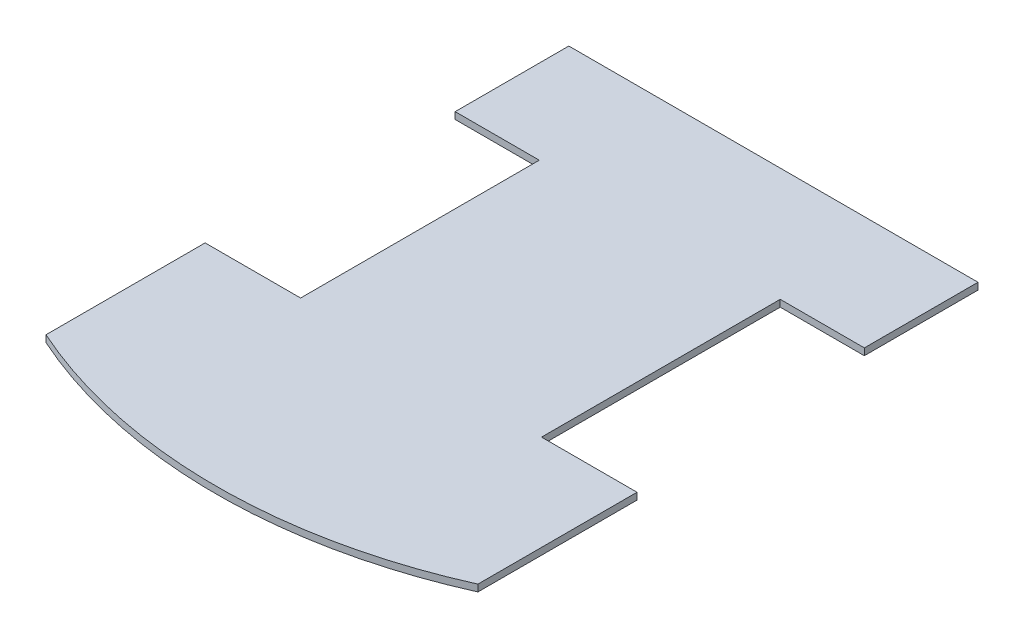
ISO-10303-21;
HEADER;
FILE_DESCRIPTION(('STEP AP214'),'2;1');
FILE_NAME('part.step','',(''),(''),'','','');
FILE_SCHEMA(('AUTOMOTIVE_DESIGN { 1 0 10303 214 1 1 1 1 }'));
ENDSEC;
DATA;
#1=APPLICATION_CONTEXT('core data for automotive mechanical design processes');
#2=APPLICATION_PROTOCOL_DEFINITION('international standard','automotive_design',2000,#1);
#3=PRODUCT_CONTEXT('',#1,'mechanical');
#4=PRODUCT('Part','Part','',(#3));
#5=PRODUCT_RELATED_PRODUCT_CATEGORY('part','',(#4));
#6=PRODUCT_DEFINITION_FORMATION('','',#4);
#7=PRODUCT_DEFINITION_CONTEXT('part definition',#1,'design');
#8=PRODUCT_DEFINITION('design','',#6,#7);
#9=PRODUCT_DEFINITION_SHAPE('','',#8);
#10=(LENGTH_UNIT() NAMED_UNIT(*) SI_UNIT(.MILLI.,.METRE.));
#11=(NAMED_UNIT(*) PLANE_ANGLE_UNIT() SI_UNIT($,.RADIAN.));
#12=(NAMED_UNIT(*) SI_UNIT($,.STERADIAN.) SOLID_ANGLE_UNIT());
#13=UNCERTAINTY_MEASURE_WITH_UNIT(LENGTH_MEASURE(1.E-05),#10,'distance_accuracy_value','');
#14=(GEOMETRIC_REPRESENTATION_CONTEXT(3) GLOBAL_UNCERTAINTY_ASSIGNED_CONTEXT((#13)) GLOBAL_UNIT_ASSIGNED_CONTEXT((#10,
#11,#12)) REPRESENTATION_CONTEXT('',''));
#15=CARTESIAN_POINT('',(0.,0.,0.));
#16=DIRECTION('',(0.,0.,1.));
#17=DIRECTION('',(1.,0.,0.));
#18=AXIS2_PLACEMENT_3D('',#15,#16,#17);
#19=CARTESIAN_POINT('',(0.,70.,-48.8497990426638));
#20=DIRECTION('',(0.,1.,0.));
#21=DIRECTION('',(0.,0.,1.));
#22=AXIS2_PLACEMENT_3D('',#19,#20,#21);
#23=PLANE('',#22);
#24=DIRECTION('',(0.,0.,1.));
#25=VECTOR('',#24,1.);
#26=CARTESIAN_POINT('',(-94.9999999999999,70.,0.));
#27=LINE('',#26,#25);
#28=CARTESIAN_POINT('',(-94.9999999999999,70.,93.633842560185));
#29=VERTEX_POINT('',#28);
#30=CARTESIAN_POINT('',(-95.,70.,163.633842560185));
#31=VERTEX_POINT('',#30);
#32=EDGE_CURVE('E218',#29,#31,#27,.T.);
#33=ORIENTED_EDGE('',*,*,#32,.F.);
#34=DIRECTION('',(-1.,0.,0.));
#35=VECTOR('',#34,1.);
#36=CARTESIAN_POINT('',(0.,70.,93.633842560185));
#37=LINE('',#36,#35);
#38=CARTESIAN_POINT('',(-53.,70.,93.633842560185));
#39=VERTEX_POINT('',#38);
#40=EDGE_CURVE('E138',#39,#29,#37,.T.);
#41=ORIENTED_EDGE('',*,*,#40,.F.);
#42=DIRECTION('',(0.,0.,1.));
#43=VECTOR('',#42,1.);
#44=CARTESIAN_POINT('',(-53.,70.,0.));
#45=LINE('',#44,#43);
#46=CARTESIAN_POINT('',(-53.,70.,-11.366157439815));
#47=VERTEX_POINT('',#46);
#48=EDGE_CURVE('E216',#47,#39,#45,.T.);
#49=ORIENTED_EDGE('',*,*,#48,.F.);
#50=DIRECTION('',(1.,0.,0.));
#51=VECTOR('',#50,1.);
#52=CARTESIAN_POINT('',(0.,70.,-11.366157439815));
#53=LINE('',#52,#51);
#54=CARTESIAN_POINT('',(-90.,70.,-11.366157439815));
#55=VERTEX_POINT('',#54);
#56=EDGE_CURVE('E217',#55,#47,#53,.T.);
#57=ORIENTED_EDGE('',*,*,#56,.F.);
#58=DIRECTION('',(0.,0.,1.));
#59=VECTOR('',#58,1.);
#60=CARTESIAN_POINT('',(-90.,70.,0.));
#61=LINE('',#60,#59);
#62=CARTESIAN_POINT('',(-90.,70.,-61.366157439815));
#63=VERTEX_POINT('',#62);
#64=EDGE_CURVE('E225',#63,#55,#61,.T.);
#65=ORIENTED_EDGE('',*,*,#64,.F.);
#66=DIRECTION('',(1.,0.,0.));
#67=VECTOR('',#66,1.);
#68=CARTESIAN_POINT('',(0.,70.,-61.366157439815));
#69=LINE('',#68,#67);
#70=CARTESIAN_POINT('',(90.,70.,-61.366157439815));
#71=VERTEX_POINT('',#70);
#72=EDGE_CURVE('E11',#63,#71,#69,.T.);
#73=ORIENTED_EDGE('',*,*,#72,.T.);
#74=DIRECTION('',(0.,0.,1.));
#75=VECTOR('',#74,1.);
#76=CARTESIAN_POINT('',(90.,70.,0.));
#77=LINE('',#76,#75);
#78=CARTESIAN_POINT('',(90.,70.,-11.366157439815));
#79=VERTEX_POINT('',#78);
#80=EDGE_CURVE('E49',#71,#79,#77,.T.);
#81=ORIENTED_EDGE('',*,*,#80,.T.);
#82=DIRECTION('',(-1.,0.,0.));
#83=VECTOR('',#82,1.);
#84=CARTESIAN_POINT('',(0.,70.,-11.366157439815));
#85=LINE('',#84,#83);
#86=CARTESIAN_POINT('',(53.,70.,-11.366157439815));
#87=VERTEX_POINT('',#86);
#88=EDGE_CURVE('E63',#79,#87,#85,.T.);
#89=ORIENTED_EDGE('',*,*,#88,.T.);
#90=DIRECTION('',(0.,0.,1.));
#91=VECTOR('',#90,1.);
#92=CARTESIAN_POINT('',(53.,70.,0.));
#93=LINE('',#92,#91);
#94=CARTESIAN_POINT('',(53.,70.,93.633842560185));
#95=VERTEX_POINT('',#94);
#96=EDGE_CURVE('E226',#87,#95,#93,.T.);
#97=ORIENTED_EDGE('',*,*,#96,.T.);
#98=DIRECTION('',(1.,0.,0.));
#99=VECTOR('',#98,1.);
#100=CARTESIAN_POINT('',(0.,70.,93.633842560185));
#101=LINE('',#100,#99);
#102=CARTESIAN_POINT('',(95.,70.,93.633842560185));
#103=VERTEX_POINT('',#102);
#104=EDGE_CURVE('E214',#95,#103,#101,.T.);
#105=ORIENTED_EDGE('',*,*,#104,.T.);
#106=DIRECTION('',(0.,0.,1.));
#107=VECTOR('',#106,1.);
#108=CARTESIAN_POINT('',(95.,70.,0.));
#109=LINE('',#108,#107);
#110=CARTESIAN_POINT('',(95.,70.,163.633842560185));
#111=VERTEX_POINT('',#110);
#112=EDGE_CURVE('E212',#103,#111,#109,.T.);
#113=ORIENTED_EDGE('',*,*,#112,.T.);
#114=CARTESIAN_POINT('',(0.,70.,-48.8497990426638));
#115=DIRECTION('',(0.,1.,0.));
#116=DIRECTION('',(0.,0.,1.));
#117=AXIS2_PLACEMENT_3D('',#114,#115,#116);
#118=CIRCLE('',#117,232.753728109364);
#119=EDGE_CURVE('E44',#31,#111,#118,.T.);
#120=ORIENTED_EDGE('',*,*,#119,.F.);
#121=EDGE_LOOP('',(#33,#41,#49,#57,#65,#73,#81,#89,#97,#105,#113,#120));
#122=FACE_BOUND('',#121,.T.);
#123=ADVANCED_FACE('F41',(#122),#23,.F.);
#124=CARTESIAN_POINT('',(0.,70.,-48.8497990426638));
#125=DIRECTION('',(0.,-1.,0.));
#126=DIRECTION('',(0.,0.,-1.));
#127=AXIS2_PLACEMENT_3D('',#124,#125,#126);
#128=CYLINDRICAL_SURFACE('',#127,232.753728109364);
#129=DIRECTION('',(0.,-1.,0.));
#130=VECTOR('',#129,1.);
#131=CARTESIAN_POINT('',(-95.,70.,163.633842560185));
#132=LINE('',#131,#130);
#133=CARTESIAN_POINT('',(-95.,73.,163.633842560185));
#134=VERTEX_POINT('',#133);
#135=EDGE_CURVE('E149',#134,#31,#132,.T.);
#136=ORIENTED_EDGE('',*,*,#135,.T.);
#137=ORIENTED_EDGE('',*,*,#119,.T.);
#138=DIRECTION('',(0.,-1.,0.));
#139=VECTOR('',#138,1.);
#140=CARTESIAN_POINT('',(95.,70.,163.633842560185));
#141=LINE('',#140,#139);
#142=CARTESIAN_POINT('',(95.,73.,163.633842560185));
#143=VERTEX_POINT('',#142);
#144=EDGE_CURVE('E209',#143,#111,#141,.T.);
#145=ORIENTED_EDGE('',*,*,#144,.F.);
#146=CARTESIAN_POINT('',(0.,73.,-48.8497990426638));
#147=DIRECTION('',(0.,1.,0.));
#148=DIRECTION('',(0.,0.,1.));
#149=AXIS2_PLACEMENT_3D('',#146,#147,#148);
#150=CIRCLE('',#149,232.753728109364);
#151=EDGE_CURVE('E152',#134,#143,#150,.T.);
#152=ORIENTED_EDGE('',*,*,#151,.F.);
#153=EDGE_LOOP('',(#136,#137,#145,#152));
#154=FACE_BOUND('',#153,.T.);
#155=ADVANCED_FACE('F231',(#154),#128,.T.);
#156=CARTESIAN_POINT('',(95.,70.,0.));
#157=DIRECTION('',(1.,0.,0.));
#158=DIRECTION('',(0.,0.,-1.));
#159=AXIS2_PLACEMENT_3D('',#156,#157,#158);
#160=PLANE('',#159);
#161=ORIENTED_EDGE('',*,*,#112,.F.);
#162=DIRECTION('',(0.,-1.,0.));
#163=VECTOR('',#162,1.);
#164=CARTESIAN_POINT('',(95.,70.,93.633842560185));
#165=LINE('',#164,#163);
#166=CARTESIAN_POINT('',(95.,73.,93.633842560185));
#167=VERTEX_POINT('',#166);
#168=EDGE_CURVE('E203',#167,#103,#165,.T.);
#169=ORIENTED_EDGE('',*,*,#168,.F.);
#170=DIRECTION('',(0.,0.,-1.));
#171=VECTOR('',#170,1.);
#172=CARTESIAN_POINT('',(94.9999999999999,73.,163.633842560185));
#173=LINE('',#172,#171);
#174=EDGE_CURVE('E161',#143,#167,#173,.T.);
#175=ORIENTED_EDGE('',*,*,#174,.F.);
#176=ORIENTED_EDGE('',*,*,#144,.T.);
#177=EDGE_LOOP('',(#161,#169,#175,#176));
#178=FACE_BOUND('',#177,.T.);
#179=ADVANCED_FACE('F234',(#178),#160,.T.);
#180=CARTESIAN_POINT('',(0.,70.,93.633842560185));
#181=DIRECTION('',(0.,0.,-1.));
#182=DIRECTION('',(-1.,0.,0.));
#183=AXIS2_PLACEMENT_3D('',#180,#181,#182);
#184=PLANE('',#183);
#185=ORIENTED_EDGE('',*,*,#104,.F.);
#186=DIRECTION('',(0.,-1.,0.));
#187=VECTOR('',#186,1.);
#188=CARTESIAN_POINT('',(53.,70.,93.633842560185));
#189=LINE('',#188,#187);
#190=CARTESIAN_POINT('',(53.,73.,93.633842560185));
#191=VERTEX_POINT('',#190);
#192=EDGE_CURVE('E205',#191,#95,#189,.T.);
#193=ORIENTED_EDGE('',*,*,#192,.F.);
#194=DIRECTION('',(-1.,0.,0.));
#195=VECTOR('',#194,1.);
#196=CARTESIAN_POINT('',(95.,73.,93.633842560185));
#197=LINE('',#196,#195);
#198=EDGE_CURVE('E163',#167,#191,#197,.T.);
#199=ORIENTED_EDGE('',*,*,#198,.F.);
#200=ORIENTED_EDGE('',*,*,#168,.T.);
#201=EDGE_LOOP('',(#185,#193,#199,#200));
#202=FACE_BOUND('',#201,.T.);
#203=ADVANCED_FACE('F236',(#202),#184,.T.);
#204=CARTESIAN_POINT('',(53.,70.,0.));
#205=DIRECTION('',(1.,0.,0.));
#206=DIRECTION('',(0.,0.,-1.));
#207=AXIS2_PLACEMENT_3D('',#204,#205,#206);
#208=PLANE('',#207);
#209=ORIENTED_EDGE('',*,*,#96,.F.);
#210=DIRECTION('',(0.,-1.,0.));
#211=VECTOR('',#210,1.);
#212=CARTESIAN_POINT('',(53.,70.,-11.366157439815));
#213=LINE('',#212,#211);
#214=CARTESIAN_POINT('',(53.,73.,-11.366157439815));
#215=VERTEX_POINT('',#214);
#216=EDGE_CURVE('E200',#215,#87,#213,.T.);
#217=ORIENTED_EDGE('',*,*,#216,.F.);
#218=DIRECTION('',(0.,0.,-1.));
#219=VECTOR('',#218,1.);
#220=CARTESIAN_POINT('',(53.,73.,93.633842560185));
#221=LINE('',#220,#219);
#222=EDGE_CURVE('E167',#191,#215,#221,.T.);
#223=ORIENTED_EDGE('',*,*,#222,.F.);
#224=ORIENTED_EDGE('',*,*,#192,.T.);
#225=EDGE_LOOP('',(#209,#217,#223,#224));
#226=FACE_BOUND('',#225,.T.);
#227=ADVANCED_FACE('F241',(#226),#208,.T.);
#228=CARTESIAN_POINT('',(0.,70.,-11.366157439815));
#229=DIRECTION('',(0.,0.,1.));
#230=DIRECTION('',(1.,0.,0.));
#231=AXIS2_PLACEMENT_3D('',#228,#229,#230);
#232=PLANE('',#231);
#233=ORIENTED_EDGE('',*,*,#88,.F.);
#234=DIRECTION('',(0.,-1.,0.));
#235=VECTOR('',#234,1.);
#236=CARTESIAN_POINT('',(90.,70.,-11.366157439815));
#237=LINE('',#236,#235);
#238=CARTESIAN_POINT('',(90.,73.,-11.366157439815));
#239=VERTEX_POINT('',#238);
#240=EDGE_CURVE('E199',#239,#79,#237,.T.);
#241=ORIENTED_EDGE('',*,*,#240,.F.);
#242=DIRECTION('',(1.,0.,0.));
#243=VECTOR('',#242,1.);
#244=CARTESIAN_POINT('',(53.,73.,-11.366157439815));
#245=LINE('',#244,#243);
#246=EDGE_CURVE('E169',#215,#239,#245,.T.);
#247=ORIENTED_EDGE('',*,*,#246,.F.);
#248=ORIENTED_EDGE('',*,*,#216,.T.);
#249=EDGE_LOOP('',(#233,#241,#247,#248));
#250=FACE_BOUND('',#249,.T.);
#251=ADVANCED_FACE('F243',(#250),#232,.T.);
#252=CARTESIAN_POINT('',(90.,70.,0.));
#253=DIRECTION('',(1.,0.,0.));
#254=DIRECTION('',(0.,0.,-1.));
#255=AXIS2_PLACEMENT_3D('',#252,#253,#254);
#256=PLANE('',#255);
#257=ORIENTED_EDGE('',*,*,#80,.F.);
#258=DIRECTION('',(0.,-1.,0.));
#259=VECTOR('',#258,1.);
#260=CARTESIAN_POINT('',(90.,70.,-61.366157439815));
#261=LINE('',#260,#259);
#262=CARTESIAN_POINT('',(90.,73.,-61.366157439815));
#263=VERTEX_POINT('',#262);
#264=EDGE_CURVE('E193',#263,#71,#261,.T.);
#265=ORIENTED_EDGE('',*,*,#264,.F.);
#266=DIRECTION('',(0.,0.,-1.));
#267=VECTOR('',#266,1.);
#268=CARTESIAN_POINT('',(90.,73.,-11.366157439815));
#269=LINE('',#268,#267);
#270=EDGE_CURVE('E171',#239,#263,#269,.T.);
#271=ORIENTED_EDGE('',*,*,#270,.F.);
#272=ORIENTED_EDGE('',*,*,#240,.T.);
#273=EDGE_LOOP('',(#257,#265,#271,#272));
#274=FACE_BOUND('',#273,.T.);
#275=ADVANCED_FACE('F245',(#274),#256,.T.);
#276=CARTESIAN_POINT('',(0.,70.,-61.366157439815));
#277=DIRECTION('',(0.,0.,-1.));
#278=DIRECTION('',(-1.,0.,0.));
#279=AXIS2_PLACEMENT_3D('',#276,#277,#278);
#280=PLANE('',#279);
#281=ORIENTED_EDGE('',*,*,#72,.F.);
#282=DIRECTION('',(0.,-1.,0.));
#283=VECTOR('',#282,1.);
#284=CARTESIAN_POINT('',(-90.,70.,-61.366157439815));
#285=LINE('',#284,#283);
#286=CARTESIAN_POINT('',(-90.,73.,-61.366157439815));
#287=VERTEX_POINT('',#286);
#288=EDGE_CURVE('E195',#287,#63,#285,.T.);
#289=ORIENTED_EDGE('',*,*,#288,.F.);
#290=DIRECTION('',(-1.,0.,0.));
#291=VECTOR('',#290,1.);
#292=CARTESIAN_POINT('',(90.,73.,-61.366157439815));
#293=LINE('',#292,#291);
#294=EDGE_CURVE('E176',#263,#287,#293,.T.);
#295=ORIENTED_EDGE('',*,*,#294,.F.);
#296=ORIENTED_EDGE('',*,*,#264,.T.);
#297=EDGE_LOOP('',(#281,#289,#295,#296));
#298=FACE_BOUND('',#297,.T.);
#299=ADVANCED_FACE('F249',(#298),#280,.T.);
#300=CARTESIAN_POINT('',(-90.,70.,0.));
#301=DIRECTION('',(1.,0.,0.));
#302=DIRECTION('',(0.,0.,-1.));
#303=AXIS2_PLACEMENT_3D('',#300,#301,#302);
#304=PLANE('',#303);
#305=ORIENTED_EDGE('',*,*,#288,.T.);
#306=ORIENTED_EDGE('',*,*,#64,.T.);
#307=DIRECTION('',(0.,-1.,0.));
#308=VECTOR('',#307,1.);
#309=CARTESIAN_POINT('',(-90.,70.,-11.366157439815));
#310=LINE('',#309,#308);
#311=CARTESIAN_POINT('',(-90.,73.,-11.366157439815));
#312=VERTEX_POINT('',#311);
#313=EDGE_CURVE('E188',#312,#55,#310,.T.);
#314=ORIENTED_EDGE('',*,*,#313,.F.);
#315=DIRECTION('',(0.,0.,1.));
#316=VECTOR('',#315,1.);
#317=CARTESIAN_POINT('',(-90.,73.,-61.366157439815));
#318=LINE('',#317,#316);
#319=EDGE_CURVE('E177',#287,#312,#318,.T.);
#320=ORIENTED_EDGE('',*,*,#319,.F.);
#321=EDGE_LOOP('',(#305,#306,#314,#320));
#322=FACE_BOUND('',#321,.T.);
#323=ADVANCED_FACE('F252',(#322),#304,.F.);
#324=CARTESIAN_POINT('',(0.,70.,-11.366157439815));
#325=DIRECTION('',(0.,0.,-1.));
#326=DIRECTION('',(-1.,0.,0.));
#327=AXIS2_PLACEMENT_3D('',#324,#325,#326);
#328=PLANE('',#327);
#329=ORIENTED_EDGE('',*,*,#313,.T.);
#330=ORIENTED_EDGE('',*,*,#56,.T.);
#331=DIRECTION('',(0.,-1.,0.));
#332=VECTOR('',#331,1.);
#333=CARTESIAN_POINT('',(-53.,70.,-11.366157439815));
#334=LINE('',#333,#332);
#335=CARTESIAN_POINT('',(-53.,73.,-11.366157439815));
#336=VERTEX_POINT('',#335);
#337=EDGE_CURVE('E186',#336,#47,#334,.T.);
#338=ORIENTED_EDGE('',*,*,#337,.F.);
#339=DIRECTION('',(1.,0.,0.));
#340=VECTOR('',#339,1.);
#341=CARTESIAN_POINT('',(-90.,73.,-11.366157439815));
#342=LINE('',#341,#340);
#343=EDGE_CURVE('E185',#312,#336,#342,.T.);
#344=ORIENTED_EDGE('',*,*,#343,.F.);
#345=EDGE_LOOP('',(#329,#330,#338,#344));
#346=FACE_BOUND('',#345,.T.);
#347=ADVANCED_FACE('F258',(#346),#328,.F.);
#348=CARTESIAN_POINT('',(0.,73.,-48.8497990426638));
#349=DIRECTION('',(0.,1.,0.));
#350=DIRECTION('',(0.,0.,1.));
#351=AXIS2_PLACEMENT_3D('',#348,#349,#350);
#352=PLANE('',#351);
#353=DIRECTION('',(-1.,0.,0.));
#354=VECTOR('',#353,1.);
#355=CARTESIAN_POINT('',(-53.,73.,93.633842560185));
#356=LINE('',#355,#354);
#357=CARTESIAN_POINT('',(-53.,73.,93.633842560185));
#358=VERTEX_POINT('',#357);
#359=CARTESIAN_POINT('',(-94.9999999999999,73.,93.633842560185));
#360=VERTEX_POINT('',#359);
#361=EDGE_CURVE('E136',#358,#360,#356,.T.);
#362=ORIENTED_EDGE('',*,*,#361,.T.);
#363=DIRECTION('',(0.,0.,1.));
#364=VECTOR('',#363,1.);
#365=CARTESIAN_POINT('',(-94.9999999999999,73.,93.633842560185));
#366=LINE('',#365,#364);
#367=EDGE_CURVE('E147',#360,#134,#366,.T.);
#368=ORIENTED_EDGE('',*,*,#367,.T.);
#369=ORIENTED_EDGE('',*,*,#151,.T.);
#370=ORIENTED_EDGE('',*,*,#174,.T.);
#371=ORIENTED_EDGE('',*,*,#198,.T.);
#372=ORIENTED_EDGE('',*,*,#222,.T.);
#373=ORIENTED_EDGE('',*,*,#246,.T.);
#374=ORIENTED_EDGE('',*,*,#270,.T.);
#375=ORIENTED_EDGE('',*,*,#294,.T.);
#376=ORIENTED_EDGE('',*,*,#319,.T.);
#377=ORIENTED_EDGE('',*,*,#343,.T.);
#378=DIRECTION('',(0.,0.,1.));
#379=VECTOR('',#378,1.);
#380=CARTESIAN_POINT('',(-53.,73.,-11.366157439815));
#381=LINE('',#380,#379);
#382=EDGE_CURVE('E142',#336,#358,#381,.T.);
#383=ORIENTED_EDGE('',*,*,#382,.T.);
#384=EDGE_LOOP('',(#362,#368,#369,#370,#371,#372,#373,#374,#375,#376,#377,#383));
#385=FACE_BOUND('',#384,.T.);
#386=ADVANCED_FACE('F155',(#385),#352,.T.);
#387=CARTESIAN_POINT('',(-94.9999999999999,70.,0.));
#388=DIRECTION('',(1.,0.,0.));
#389=DIRECTION('',(0.,0.,-1.));
#390=AXIS2_PLACEMENT_3D('',#387,#388,#389);
#391=PLANE('',#390);
#392=DIRECTION('',(0.,-1.,0.));
#393=VECTOR('',#392,1.);
#394=CARTESIAN_POINT('',(-94.9999999999999,70.,93.633842560185));
#395=LINE('',#394,#393);
#396=EDGE_CURVE('E131',#360,#29,#395,.T.);
#397=ORIENTED_EDGE('',*,*,#396,.T.);
#398=ORIENTED_EDGE('',*,*,#32,.T.);
#399=ORIENTED_EDGE('',*,*,#135,.F.);
#400=ORIENTED_EDGE('',*,*,#367,.F.);
#401=EDGE_LOOP('',(#397,#398,#399,#400));
#402=FACE_BOUND('',#401,.T.);
#403=ADVANCED_FACE('F43',(#402),#391,.F.);
#404=CARTESIAN_POINT('',(-53.,70.,0.));
#405=DIRECTION('',(1.,0.,0.));
#406=DIRECTION('',(0.,0.,-1.));
#407=AXIS2_PLACEMENT_3D('',#404,#405,#406);
#408=PLANE('',#407);
#409=ORIENTED_EDGE('',*,*,#337,.T.);
#410=ORIENTED_EDGE('',*,*,#48,.T.);
#411=DIRECTION('',(0.,-1.,0.));
#412=VECTOR('',#411,1.);
#413=CARTESIAN_POINT('',(-53.,70.,93.633842560185));
#414=LINE('',#413,#412);
#415=EDGE_CURVE('E145',#358,#39,#414,.T.);
#416=ORIENTED_EDGE('',*,*,#415,.F.);
#417=ORIENTED_EDGE('',*,*,#382,.F.);
#418=EDGE_LOOP('',(#409,#410,#416,#417));
#419=FACE_BOUND('',#418,.T.);
#420=ADVANCED_FACE('F260',(#419),#408,.F.);
#421=CARTESIAN_POINT('',(0.,70.,93.633842560185));
#422=DIRECTION('',(0.,0.,1.));
#423=DIRECTION('',(1.,0.,0.));
#424=AXIS2_PLACEMENT_3D('',#421,#422,#423);
#425=PLANE('',#424);
#426=ORIENTED_EDGE('',*,*,#415,.T.);
#427=ORIENTED_EDGE('',*,*,#40,.T.);
#428=ORIENTED_EDGE('',*,*,#396,.F.);
#429=ORIENTED_EDGE('',*,*,#361,.F.);
#430=EDGE_LOOP('',(#426,#427,#428,#429));
#431=FACE_BOUND('',#430,.T.);
#432=ADVANCED_FACE('F132',(#431),#425,.F.);
#433=CLOSED_SHELL('',(#123,#155,#179,#203,#227,#251,#275,#299,#323,#347,#386,#403,#420,#432));
#434=MANIFOLD_SOLID_BREP('B2',#433);
#435=ADVANCED_BREP_SHAPE_REPRESENTATION('',(#18,#434),#14);
#436=SHAPE_DEFINITION_REPRESENTATION(#9,#435);
ENDSEC;
END-ISO-10303-21;
